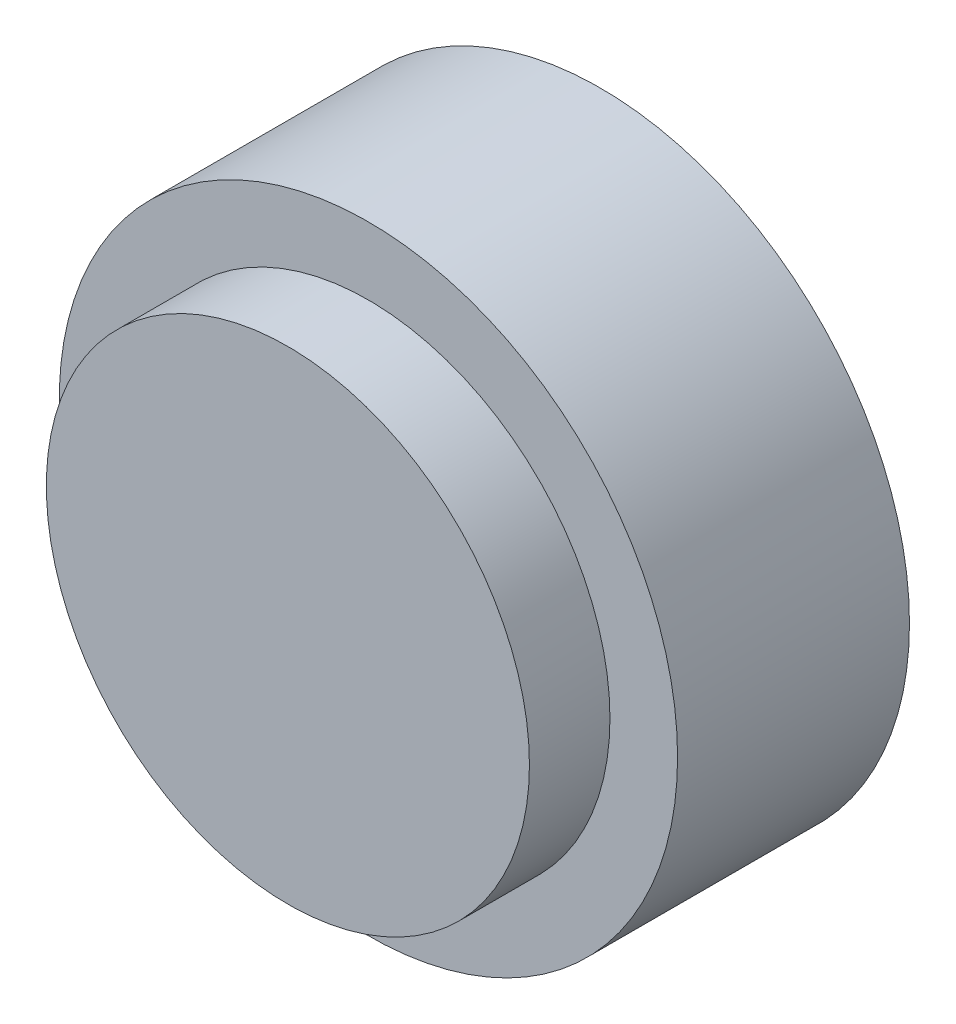
ISO-10303-21;
HEADER;
FILE_DESCRIPTION(('STEP AP214'),'2;1');
FILE_NAME('part.step','',(''),(''),'','','');
FILE_SCHEMA(('AUTOMOTIVE_DESIGN { 1 0 10303 214 1 1 1 1 }'));
ENDSEC;
DATA;
#1=APPLICATION_CONTEXT('core data for automotive mechanical design processes');
#2=APPLICATION_PROTOCOL_DEFINITION('international standard','automotive_design',2000,#1);
#3=PRODUCT_CONTEXT('',#1,'mechanical');
#4=PRODUCT('Part','Part','',(#3));
#5=PRODUCT_RELATED_PRODUCT_CATEGORY('part','',(#4));
#6=PRODUCT_DEFINITION_FORMATION('','',#4);
#7=PRODUCT_DEFINITION_CONTEXT('part definition',#1,'design');
#8=PRODUCT_DEFINITION('design','',#6,#7);
#9=PRODUCT_DEFINITION_SHAPE('','',#8);
#10=(LENGTH_UNIT() NAMED_UNIT(*) SI_UNIT(.MILLI.,.METRE.));
#11=(NAMED_UNIT(*) PLANE_ANGLE_UNIT() SI_UNIT($,.RADIAN.));
#12=(NAMED_UNIT(*) SI_UNIT($,.STERADIAN.) SOLID_ANGLE_UNIT());
#13=UNCERTAINTY_MEASURE_WITH_UNIT(LENGTH_MEASURE(1.E-05),#10,'distance_accuracy_value','');
#14=(GEOMETRIC_REPRESENTATION_CONTEXT(3) GLOBAL_UNCERTAINTY_ASSIGNED_CONTEXT((#13)) GLOBAL_UNIT_ASSIGNED_CONTEXT((#10,
#11,#12)) REPRESENTATION_CONTEXT('',''));
#15=CARTESIAN_POINT('',(0.,0.,0.));
#16=DIRECTION('',(0.,0.,1.));
#17=DIRECTION('',(1.,0.,0.));
#18=AXIS2_PLACEMENT_3D('',#15,#16,#17);
#19=CARTESIAN_POINT('',(0.,0.,12.5));
#20=DIRECTION('',(0.,0.,-1.));
#21=DIRECTION('',(-1.,0.,0.));
#22=AXIS2_PLACEMENT_3D('',#19,#20,#21);
#23=CYLINDRICAL_SURFACE('',#22,37.5);
#24=CARTESIAN_POINT('',(0.,0.,12.5));
#25=DIRECTION('',(0.,0.,1.));
#26=DIRECTION('',(1.,0.,0.));
#27=AXIS2_PLACEMENT_3D('',#24,#25,#26);
#28=CIRCLE('',#27,37.5);
#29=CARTESIAN_POINT('',(37.5,0.,12.5));
#30=VERTEX_POINT('',#29);
#31=EDGE_CURVE('E49',#30,#30,#28,.T.);
#32=ORIENTED_EDGE('',*,*,#31,.F.);
#33=EDGE_LOOP('',(#32));
#34=FACE_BOUND('',#33,.T.);
#35=CARTESIAN_POINT('',(0.,0.,0.));
#36=DIRECTION('',(0.,0.,1.));
#37=DIRECTION('',(1.,0.,0.));
#38=AXIS2_PLACEMENT_3D('',#35,#36,#37);
#39=CIRCLE('',#38,37.5);
#40=CARTESIAN_POINT('',(37.5,0.,0.));
#41=VERTEX_POINT('',#40);
#42=EDGE_CURVE('E161',#41,#41,#39,.T.);
#43=ORIENTED_EDGE('',*,*,#42,.T.);
#44=EDGE_LOOP('',(#43));
#45=FACE_BOUND('',#44,.T.);
#46=ADVANCED_FACE('F42',(#34,#45),#23,.T.);
#47=CARTESIAN_POINT('',(0.,0.,12.5));
#48=DIRECTION('',(0.,0.,1.));
#49=DIRECTION('',(1.,0.,0.));
#50=AXIS2_PLACEMENT_3D('',#47,#48,#49);
#51=PLANE('',#50);
#52=ORIENTED_EDGE('',*,*,#31,.T.);
#53=EDGE_LOOP('',(#52));
#54=FACE_BOUND('',#53,.T.);
#55=ADVANCED_FACE('F168',(#54),#51,.T.);
#56=CARTESIAN_POINT('',(0.,0.,-36.));
#57=DIRECTION('',(0.,0.,1.));
#58=DIRECTION('',(1.,0.,0.));
#59=AXIS2_PLACEMENT_3D('',#56,#57,#58);
#60=CYLINDRICAL_SURFACE('',#59,48.);
#61=CARTESIAN_POINT('',(0.,0.,-36.));
#62=DIRECTION('',(0.,0.,1.));
#63=DIRECTION('',(1.,0.,0.));
#64=AXIS2_PLACEMENT_3D('',#61,#62,#63);
#65=CIRCLE('',#64,48.);
#66=CARTESIAN_POINT('',(48.,0.,-36.));
#67=VERTEX_POINT('',#66);
#68=EDGE_CURVE('E155',#67,#67,#65,.T.);
#69=ORIENTED_EDGE('',*,*,#68,.T.);
#70=EDGE_LOOP('',(#69));
#71=FACE_BOUND('',#70,.T.);
#72=CARTESIAN_POINT('',(0.,0.,0.));
#73=DIRECTION('',(0.,0.,1.));
#74=DIRECTION('',(1.,0.,0.));
#75=AXIS2_PLACEMENT_3D('',#72,#73,#74);
#76=CIRCLE('',#75,48.);
#77=CARTESIAN_POINT('',(48.,0.,0.));
#78=VERTEX_POINT('',#77);
#79=EDGE_CURVE('E154',#78,#78,#76,.T.);
#80=ORIENTED_EDGE('',*,*,#79,.F.);
#81=EDGE_LOOP('',(#80));
#82=FACE_BOUND('',#81,.T.);
#83=ADVANCED_FACE('F182',(#71,#82),#60,.T.);
#84=CARTESIAN_POINT('',(0.,0.,-36.));
#85=DIRECTION('',(0.,0.,1.));
#86=DIRECTION('',(1.,0.,0.));
#87=AXIS2_PLACEMENT_3D('',#84,#85,#86);
#88=CYLINDRICAL_SURFACE('',#87,21.);
#89=CARTESIAN_POINT('',(0.,0.,-36.));
#90=DIRECTION('',(0.,0.,1.));
#91=DIRECTION('',(1.,0.,0.));
#92=AXIS2_PLACEMENT_3D('',#89,#90,#91);
#93=CIRCLE('',#92,21.);
#94=CARTESIAN_POINT('',(21.,0.,-36.));
#95=VERTEX_POINT('',#94);
#96=EDGE_CURVE('E158',#95,#95,#93,.T.);
#97=ORIENTED_EDGE('',*,*,#96,.F.);
#98=EDGE_LOOP('',(#97));
#99=FACE_BOUND('',#98,.T.);
#100=CARTESIAN_POINT('',(0.,0.,0.));
#101=DIRECTION('',(0.,0.,1.));
#102=DIRECTION('',(1.,0.,0.));
#103=AXIS2_PLACEMENT_3D('',#100,#101,#102);
#104=CIRCLE('',#103,21.);
#105=CARTESIAN_POINT('',(21.,0.,0.));
#106=VERTEX_POINT('',#105);
#107=EDGE_CURVE('E11',#106,#106,#104,.T.);
#108=ORIENTED_EDGE('',*,*,#107,.T.);
#109=EDGE_LOOP('',(#108));
#110=FACE_BOUND('',#109,.T.);
#111=ADVANCED_FACE('F184',(#99,#110),#88,.F.);
#112=CARTESIAN_POINT('',(0.,0.,-36.));
#113=DIRECTION('',(0.,0.,1.));
#114=DIRECTION('',(1.,0.,0.));
#115=AXIS2_PLACEMENT_3D('',#112,#113,#114);
#116=PLANE('',#115);
#117=CARTESIAN_POINT('',(0.,42.,-36.));
#118=DIRECTION('',(0.,0.,-1.));
#119=DIRECTION('',(-1.,0.,0.));
#120=AXIS2_PLACEMENT_3D('',#117,#118,#119);
#121=CIRCLE('',#120,2.025);
#122=CARTESIAN_POINT('',(-2.025,42.,-36.));
#123=VERTEX_POINT('',#122);
#124=EDGE_CURVE('E91',#123,#123,#121,.T.);
#125=ORIENTED_EDGE('',*,*,#124,.F.);
#126=EDGE_LOOP('',(#125));
#127=FACE_BOUND('',#126,.T.);
#128=CARTESIAN_POINT('',(-29.6984848098355,29.6984848098363,-36.));
#129=DIRECTION('',(0.,0.,-1.));
#130=DIRECTION('',(-1.,0.,0.));
#131=AXIS2_PLACEMENT_3D('',#128,#129,#130);
#132=CIRCLE('',#131,2.025);
#133=CARTESIAN_POINT('',(-31.7234848098355,29.6984848098363,-36.));
#134=VERTEX_POINT('',#133);
#135=EDGE_CURVE('E84',#134,#134,#132,.T.);
#136=ORIENTED_EDGE('',*,*,#135,.F.);
#137=EDGE_LOOP('',(#136));
#138=FACE_BOUND('',#137,.T.);
#139=CARTESIAN_POINT('',(-42.0000000000018,1.78285241928082E-12,-36.));
#140=DIRECTION('',(0.,0.,-1.));
#141=DIRECTION('',(-1.,0.,0.));
#142=AXIS2_PLACEMENT_3D('',#139,#140,#141);
#143=CIRCLE('',#142,2.025);
#144=CARTESIAN_POINT('',(-44.0250000000018,1.78285241928082E-12,-36.));
#145=VERTEX_POINT('',#144);
#146=EDGE_CURVE('E100',#145,#145,#143,.T.);
#147=ORIENTED_EDGE('',*,*,#146,.F.);
#148=EDGE_LOOP('',(#147));
#149=FACE_BOUND('',#148,.T.);
#150=CARTESIAN_POINT('',(-29.698484809838,-29.6984848098337,-36.));
#151=DIRECTION('',(0.,0.,-1.));
#152=DIRECTION('',(-1.,0.,0.));
#153=AXIS2_PLACEMENT_3D('',#150,#151,#152);
#154=CIRCLE('',#153,2.025);
#155=CARTESIAN_POINT('',(-31.723484809838,-29.6984848098337,-36.));
#156=VERTEX_POINT('',#155);
#157=EDGE_CURVE('E109',#156,#156,#154,.T.);
#158=ORIENTED_EDGE('',*,*,#157,.F.);
#159=EDGE_LOOP('',(#158));
#160=FACE_BOUND('',#159,.T.);
#161=CARTESIAN_POINT('',(-3.56570483856165E-12,-42.,-36.));
#162=DIRECTION('',(0.,0.,-1.));
#163=DIRECTION('',(-1.,0.,0.));
#164=AXIS2_PLACEMENT_3D('',#161,#162,#163);
#165=CIRCLE('',#164,2.025);
#166=CARTESIAN_POINT('',(-2.02500000000357,-42.,-36.));
#167=VERTEX_POINT('',#166);
#168=EDGE_CURVE('E118',#167,#167,#165,.T.);
#169=ORIENTED_EDGE('',*,*,#168,.F.);
#170=EDGE_LOOP('',(#169));
#171=FACE_BOUND('',#170,.T.);
#172=CARTESIAN_POINT('',(29.698484809832,-29.6984848098363,-36.));
#173=DIRECTION('',(0.,0.,-1.));
#174=DIRECTION('',(-1.,0.,0.));
#175=AXIS2_PLACEMENT_3D('',#172,#173,#174);
#176=CIRCLE('',#175,2.025);
#177=CARTESIAN_POINT('',(27.673484809832,-29.6984848098363,-36.));
#178=VERTEX_POINT('',#177);
#179=EDGE_CURVE('E127',#178,#178,#176,.T.);
#180=ORIENTED_EDGE('',*,*,#179,.F.);
#181=EDGE_LOOP('',(#180));
#182=FACE_BOUND('',#181,.T.);
#183=CARTESIAN_POINT('',(41.9999999999982,-1.78799593583724E-12,-36.));
#184=DIRECTION('',(0.,0.,-1.));
#185=DIRECTION('',(-1.,0.,0.));
#186=AXIS2_PLACEMENT_3D('',#183,#184,#185);
#187=CIRCLE('',#186,2.025);
#188=CARTESIAN_POINT('',(39.9749999999982,-1.78799593583724E-12,-36.));
#189=VERTEX_POINT('',#188);
#190=EDGE_CURVE('E136',#189,#189,#187,.T.);
#191=ORIENTED_EDGE('',*,*,#190,.F.);
#192=EDGE_LOOP('',(#191));
#193=FACE_BOUND('',#192,.T.);
#194=CARTESIAN_POINT('',(29.6984848098345,29.6984848098337,-36.));
#195=DIRECTION('',(0.,0.,-1.));
#196=DIRECTION('',(-1.,0.,0.));
#197=AXIS2_PLACEMENT_3D('',#194,#195,#196);
#198=CIRCLE('',#197,2.025);
#199=CARTESIAN_POINT('',(27.6734848098345,29.6984848098337,-36.));
#200=VERTEX_POINT('',#199);
#201=EDGE_CURVE('E145',#200,#200,#198,.T.);
#202=ORIENTED_EDGE('',*,*,#201,.F.);
#203=EDGE_LOOP('',(#202));
#204=FACE_BOUND('',#203,.T.);
#205=ORIENTED_EDGE('',*,*,#68,.F.);
#206=EDGE_LOOP('',(#205));
#207=FACE_BOUND('',#206,.T.);
#208=ORIENTED_EDGE('',*,*,#96,.T.);
#209=EDGE_LOOP('',(#208));
#210=FACE_BOUND('',#209,.T.);
#211=ADVANCED_FACE('F178',(#127,#138,#149,#160,#171,#182,#193,#204,#207,#210),#116,.F.);
#212=CARTESIAN_POINT('',(0.,0.,0.));
#213=DIRECTION('',(0.,0.,1.));
#214=DIRECTION('',(1.,0.,0.));
#215=AXIS2_PLACEMENT_3D('',#212,#213,#214);
#216=PLANE('',#215);
#217=ORIENTED_EDGE('',*,*,#42,.F.);
#218=EDGE_LOOP('',(#217));
#219=FACE_BOUND('',#218,.T.);
#220=ORIENTED_EDGE('',*,*,#79,.T.);
#221=EDGE_LOOP('',(#220));
#222=FACE_BOUND('',#221,.T.);
#223=ADVANCED_FACE('F174',(#219,#222),#216,.T.);
#224=CARTESIAN_POINT('',(0.,0.,0.));
#225=DIRECTION('',(0.,0.,1.));
#226=DIRECTION('',(1.,0.,0.));
#227=AXIS2_PLACEMENT_3D('',#224,#225,#226);
#228=PLANE('',#227);
#229=ORIENTED_EDGE('',*,*,#107,.F.);
#230=EDGE_LOOP('',(#229));
#231=FACE_BOUND('',#230,.T.);
#232=ADVANCED_FACE('F177',(#231),#228,.F.);
#233=CARTESIAN_POINT('',(29.6984848098345,29.6984848098337,-30.4));
#234=DIRECTION('',(0.,0.,-1.));
#235=DIRECTION('',(-1.,0.,0.));
#236=AXIS2_PLACEMENT_3D('',#233,#234,#235);
#237=CONICAL_SURFACE('',#236,1.65,1.02974425867665);
#238=CARTESIAN_POINT('',(29.6984848098345,29.6984848098337,-29.4085799786045));
#239=VERTEX_POINT('',#238);
#240=VERTEX_LOOP('',#239);
#241=FACE_BOUND('',#240,.T.);
#242=CARTESIAN_POINT('',(29.6984848098345,29.6984848098337,-30.4));
#243=DIRECTION('',(0.,0.,-1.));
#244=DIRECTION('',(-1.,0.,0.));
#245=AXIS2_PLACEMENT_3D('',#242,#243,#244);
#246=CIRCLE('',#245,1.65);
#247=CARTESIAN_POINT('',(28.0484848098345,29.6984848098337,-30.4));
#248=VERTEX_POINT('',#247);
#249=EDGE_CURVE('E151',#248,#248,#246,.T.);
#250=ORIENTED_EDGE('',*,*,#249,.T.);
#251=EDGE_LOOP('',(#250));
#252=FACE_BOUND('',#251,.T.);
#253=ADVANCED_FACE('F195',(#241,#252),#237,.F.);
#254=CARTESIAN_POINT('',(29.6984848098345,29.6984848098337,-36.));
#255=DIRECTION('',(0.,0.,-1.));
#256=DIRECTION('',(-1.,0.,0.));
#257=AXIS2_PLACEMENT_3D('',#254,#255,#256);
#258=CYLINDRICAL_SURFACE('',#257,1.65);
#259=ORIENTED_EDGE('',*,*,#249,.F.);
#260=EDGE_LOOP('',(#259));
#261=FACE_BOUND('',#260,.T.);
#262=CARTESIAN_POINT('',(29.6984848098345,29.6984848098337,-35.625));
#263=DIRECTION('',(0.,0.,-1.));
#264=DIRECTION('',(-1.,0.,0.));
#265=AXIS2_PLACEMENT_3D('',#262,#263,#264);
#266=CIRCLE('',#265,1.65);
#267=CARTESIAN_POINT('',(28.0484848098345,29.6984848098337,-35.625));
#268=VERTEX_POINT('',#267);
#269=EDGE_CURVE('E148',#268,#268,#266,.T.);
#270=ORIENTED_EDGE('',*,*,#269,.T.);
#271=EDGE_LOOP('',(#270));
#272=FACE_BOUND('',#271,.T.);
#273=ADVANCED_FACE('F200',(#261,#272),#258,.F.);
#274=CARTESIAN_POINT('',(29.6984848098345,29.6984848098337,-36.));
#275=DIRECTION('',(0.,0.,-1.));
#276=DIRECTION('',(-1.,0.,0.));
#277=AXIS2_PLACEMENT_3D('',#274,#275,#276);
#278=CONICAL_SURFACE('',#277,2.025,0.785398163397458);
#279=ORIENTED_EDGE('',*,*,#269,.F.);
#280=EDGE_LOOP('',(#279));
#281=FACE_BOUND('',#280,.T.);
#282=ORIENTED_EDGE('',*,*,#201,.T.);
#283=EDGE_LOOP('',(#282));
#284=FACE_BOUND('',#283,.T.);
#285=ADVANCED_FACE('F207',(#281,#284),#278,.F.);
#286=CARTESIAN_POINT('',(41.9999999999982,-1.78799593583724E-12,-30.4));
#287=DIRECTION('',(0.,0.,-1.));
#288=DIRECTION('',(-1.,0.,0.));
#289=AXIS2_PLACEMENT_3D('',#286,#287,#288);
#290=CONICAL_SURFACE('',#289,1.65,1.02974425867666);
#291=CARTESIAN_POINT('',(41.9999999999982,-1.78799593583724E-12,-29.4085799786045));
#292=VERTEX_POINT('',#291);
#293=VERTEX_LOOP('',#292);
#294=FACE_BOUND('',#293,.T.);
#295=CARTESIAN_POINT('',(41.9999999999982,-1.78799593583724E-12,-30.4));
#296=DIRECTION('',(0.,0.,-1.));
#297=DIRECTION('',(-1.,0.,0.));
#298=AXIS2_PLACEMENT_3D('',#295,#296,#297);
#299=CIRCLE('',#298,1.65);
#300=CARTESIAN_POINT('',(40.3499999999982,-1.78799593583724E-12,-30.4));
#301=VERTEX_POINT('',#300);
#302=EDGE_CURVE('E142',#301,#301,#299,.T.);
#303=ORIENTED_EDGE('',*,*,#302,.T.);
#304=EDGE_LOOP('',(#303));
#305=FACE_BOUND('',#304,.T.);
#306=ADVANCED_FACE('F239',(#294,#305),#290,.F.);
#307=CARTESIAN_POINT('',(41.9999999999982,-1.78799593583724E-12,-36.));
#308=DIRECTION('',(0.,0.,-1.));
#309=DIRECTION('',(-1.,0.,0.));
#310=AXIS2_PLACEMENT_3D('',#307,#308,#309);
#311=CYLINDRICAL_SURFACE('',#310,1.65);
#312=ORIENTED_EDGE('',*,*,#302,.F.);
#313=EDGE_LOOP('',(#312));
#314=FACE_BOUND('',#313,.T.);
#315=CARTESIAN_POINT('',(41.9999999999982,-1.78799593583724E-12,-35.625));
#316=DIRECTION('',(0.,0.,-1.));
#317=DIRECTION('',(-1.,0.,0.));
#318=AXIS2_PLACEMENT_3D('',#315,#316,#317);
#319=CIRCLE('',#318,1.65);
#320=CARTESIAN_POINT('',(40.3499999999982,-1.78799593583724E-12,-35.625));
#321=VERTEX_POINT('',#320);
#322=EDGE_CURVE('E139',#321,#321,#319,.T.);
#323=ORIENTED_EDGE('',*,*,#322,.T.);
#324=EDGE_LOOP('',(#323));
#325=FACE_BOUND('',#324,.T.);
#326=ADVANCED_FACE('F244',(#314,#325),#311,.F.);
#327=CARTESIAN_POINT('',(41.9999999999982,-1.78799593583724E-12,-36.));
#328=DIRECTION('',(0.,0.,-1.));
#329=DIRECTION('',(-1.,0.,0.));
#330=AXIS2_PLACEMENT_3D('',#327,#328,#329);
#331=CONICAL_SURFACE('',#330,2.025,0.785398163397448);
#332=ORIENTED_EDGE('',*,*,#322,.F.);
#333=EDGE_LOOP('',(#332));
#334=FACE_BOUND('',#333,.T.);
#335=ORIENTED_EDGE('',*,*,#190,.T.);
#336=EDGE_LOOP('',(#335));
#337=FACE_BOUND('',#336,.T.);
#338=ADVANCED_FACE('F250',(#334,#337),#331,.F.);
#339=CARTESIAN_POINT('',(29.698484809832,-29.6984848098363,-30.4));
#340=DIRECTION('',(0.,0.,-1.));
#341=DIRECTION('',(-1.,0.,0.));
#342=AXIS2_PLACEMENT_3D('',#339,#340,#341);
#343=CONICAL_SURFACE('',#342,1.65,1.02974425867666);
#344=CARTESIAN_POINT('',(29.698484809832,-29.6984848098363,-29.4085799786045));
#345=VERTEX_POINT('',#344);
#346=VERTEX_LOOP('',#345);
#347=FACE_BOUND('',#346,.T.);
#348=CARTESIAN_POINT('',(29.698484809832,-29.6984848098363,-30.4));
#349=DIRECTION('',(0.,0.,-1.));
#350=DIRECTION('',(-1.,0.,0.));
#351=AXIS2_PLACEMENT_3D('',#348,#349,#350);
#352=CIRCLE('',#351,1.65);
#353=CARTESIAN_POINT('',(28.048484809832,-29.6984848098363,-30.4));
#354=VERTEX_POINT('',#353);
#355=EDGE_CURVE('E133',#354,#354,#352,.T.);
#356=ORIENTED_EDGE('',*,*,#355,.T.);
#357=EDGE_LOOP('',(#356));
#358=FACE_BOUND('',#357,.T.);
#359=ADVANCED_FACE('F254',(#347,#358),#343,.F.);
#360=CARTESIAN_POINT('',(29.698484809832,-29.6984848098363,-36.));
#361=DIRECTION('',(0.,0.,-1.));
#362=DIRECTION('',(-1.,0.,0.));
#363=AXIS2_PLACEMENT_3D('',#360,#361,#362);
#364=CYLINDRICAL_SURFACE('',#363,1.65);
#365=ORIENTED_EDGE('',*,*,#355,.F.);
#366=EDGE_LOOP('',(#365));
#367=FACE_BOUND('',#366,.T.);
#368=CARTESIAN_POINT('',(29.698484809832,-29.6984848098363,-35.625));
#369=DIRECTION('',(0.,0.,-1.));
#370=DIRECTION('',(-1.,0.,0.));
#371=AXIS2_PLACEMENT_3D('',#368,#369,#370);
#372=CIRCLE('',#371,1.65);
#373=CARTESIAN_POINT('',(28.048484809832,-29.6984848098363,-35.625));
#374=VERTEX_POINT('',#373);
#375=EDGE_CURVE('E130',#374,#374,#372,.T.);
#376=ORIENTED_EDGE('',*,*,#375,.T.);
#377=EDGE_LOOP('',(#376));
#378=FACE_BOUND('',#377,.T.);
#379=ADVANCED_FACE('F258',(#367,#378),#364,.F.);
#380=CARTESIAN_POINT('',(29.698484809832,-29.6984848098363,-36.));
#381=DIRECTION('',(0.,0.,-1.));
#382=DIRECTION('',(-1.,0.,0.));
#383=AXIS2_PLACEMENT_3D('',#380,#381,#382);
#384=CONICAL_SURFACE('',#383,2.025,0.785398163397448);
#385=ORIENTED_EDGE('',*,*,#375,.F.);
#386=EDGE_LOOP('',(#385));
#387=FACE_BOUND('',#386,.T.);
#388=ORIENTED_EDGE('',*,*,#179,.T.);
#389=EDGE_LOOP('',(#388));
#390=FACE_BOUND('',#389,.T.);
#391=ADVANCED_FACE('F262',(#387,#390),#384,.F.);
#392=CARTESIAN_POINT('',(-3.56570483856165E-12,-42.,-30.4));
#393=DIRECTION('',(0.,0.,-1.));
#394=DIRECTION('',(-1.,0.,0.));
#395=AXIS2_PLACEMENT_3D('',#392,#393,#394);
#396=CONICAL_SURFACE('',#395,1.65,1.02974425867665);
#397=CARTESIAN_POINT('',(-3.56731927084786E-12,-42.,-29.4085799786045));
#398=VERTEX_POINT('',#397);
#399=VERTEX_LOOP('',#398);
#400=FACE_BOUND('',#399,.T.);
#401=CARTESIAN_POINT('',(-3.56570483856165E-12,-42.,-30.4));
#402=DIRECTION('',(0.,0.,-1.));
#403=DIRECTION('',(-1.,0.,0.));
#404=AXIS2_PLACEMENT_3D('',#401,#402,#403);
#405=CIRCLE('',#404,1.65);
#406=CARTESIAN_POINT('',(-1.65000000000356,-42.,-30.4));
#407=VERTEX_POINT('',#406);
#408=EDGE_CURVE('E124',#407,#407,#405,.T.);
#409=ORIENTED_EDGE('',*,*,#408,.T.);
#410=EDGE_LOOP('',(#409));
#411=FACE_BOUND('',#410,.T.);
#412=ADVANCED_FACE('F266',(#400,#411),#396,.F.);
#413=CARTESIAN_POINT('',(-3.56570483856165E-12,-42.,-36.));
#414=DIRECTION('',(0.,0.,-1.));
#415=DIRECTION('',(-1.,0.,0.));
#416=AXIS2_PLACEMENT_3D('',#413,#414,#415);
#417=CYLINDRICAL_SURFACE('',#416,1.65);
#418=ORIENTED_EDGE('',*,*,#408,.F.);
#419=EDGE_LOOP('',(#418));
#420=FACE_BOUND('',#419,.T.);
#421=CARTESIAN_POINT('',(-3.56570483856165E-12,-42.,-35.625));
#422=DIRECTION('',(0.,0.,-1.));
#423=DIRECTION('',(-1.,0.,0.));
#424=AXIS2_PLACEMENT_3D('',#421,#422,#423);
#425=CIRCLE('',#424,1.65);
#426=CARTESIAN_POINT('',(-1.65000000000356,-42.,-35.625));
#427=VERTEX_POINT('',#426);
#428=EDGE_CURVE('E121',#427,#427,#425,.T.);
#429=ORIENTED_EDGE('',*,*,#428,.T.);
#430=EDGE_LOOP('',(#429));
#431=FACE_BOUND('',#430,.T.);
#432=ADVANCED_FACE('F270',(#420,#431),#417,.F.);
#433=CARTESIAN_POINT('',(-3.56570483856165E-12,-42.,-36.));
#434=DIRECTION('',(0.,0.,-1.));
#435=DIRECTION('',(-1.,0.,0.));
#436=AXIS2_PLACEMENT_3D('',#433,#434,#435);
#437=CONICAL_SURFACE('',#436,2.025,0.78539816339745);
#438=ORIENTED_EDGE('',*,*,#428,.F.);
#439=EDGE_LOOP('',(#438));
#440=FACE_BOUND('',#439,.T.);
#441=ORIENTED_EDGE('',*,*,#168,.T.);
#442=EDGE_LOOP('',(#441));
#443=FACE_BOUND('',#442,.T.);
#444=ADVANCED_FACE('F274',(#440,#443),#437,.F.);
#445=CARTESIAN_POINT('',(-29.698484809838,-29.6984848098337,-30.4));
#446=DIRECTION('',(0.,0.,-1.));
#447=DIRECTION('',(-1.,0.,0.));
#448=AXIS2_PLACEMENT_3D('',#445,#446,#447);
#449=CONICAL_SURFACE('',#448,1.65,1.02974425867666);
#450=CARTESIAN_POINT('',(-29.698484809838,-29.6984848098337,-29.4085799786045));
#451=VERTEX_POINT('',#450);
#452=VERTEX_LOOP('',#451);
#453=FACE_BOUND('',#452,.T.);
#454=CARTESIAN_POINT('',(-29.698484809838,-29.6984848098337,-30.4));
#455=DIRECTION('',(0.,0.,-1.));
#456=DIRECTION('',(-1.,0.,0.));
#457=AXIS2_PLACEMENT_3D('',#454,#455,#456);
#458=CIRCLE('',#457,1.65);
#459=CARTESIAN_POINT('',(-31.348484809838,-29.6984848098337,-30.4));
#460=VERTEX_POINT('',#459);
#461=EDGE_CURVE('E115',#460,#460,#458,.T.);
#462=ORIENTED_EDGE('',*,*,#461,.T.);
#463=EDGE_LOOP('',(#462));
#464=FACE_BOUND('',#463,.T.);
#465=ADVANCED_FACE('F278',(#453,#464),#449,.F.);
#466=CARTESIAN_POINT('',(-29.698484809838,-29.6984848098337,-36.));
#467=DIRECTION('',(0.,0.,-1.));
#468=DIRECTION('',(-1.,0.,0.));
#469=AXIS2_PLACEMENT_3D('',#466,#467,#468);
#470=CYLINDRICAL_SURFACE('',#469,1.65);
#471=ORIENTED_EDGE('',*,*,#461,.F.);
#472=EDGE_LOOP('',(#471));
#473=FACE_BOUND('',#472,.T.);
#474=CARTESIAN_POINT('',(-29.698484809838,-29.6984848098337,-35.625));
#475=DIRECTION('',(0.,0.,-1.));
#476=DIRECTION('',(-1.,0.,0.));
#477=AXIS2_PLACEMENT_3D('',#474,#475,#476);
#478=CIRCLE('',#477,1.65);
#479=CARTESIAN_POINT('',(-31.348484809838,-29.6984848098337,-35.625));
#480=VERTEX_POINT('',#479);
#481=EDGE_CURVE('E112',#480,#480,#478,.T.);
#482=ORIENTED_EDGE('',*,*,#481,.T.);
#483=EDGE_LOOP('',(#482));
#484=FACE_BOUND('',#483,.T.);
#485=ADVANCED_FACE('F282',(#473,#484),#470,.F.);
#486=CARTESIAN_POINT('',(-29.698484809838,-29.6984848098337,-36.));
#487=DIRECTION('',(0.,0.,-1.));
#488=DIRECTION('',(-1.,0.,0.));
#489=AXIS2_PLACEMENT_3D('',#486,#487,#488);
#490=CONICAL_SURFACE('',#489,2.025,0.785398163397448);
#491=ORIENTED_EDGE('',*,*,#481,.F.);
#492=EDGE_LOOP('',(#491));
#493=FACE_BOUND('',#492,.T.);
#494=ORIENTED_EDGE('',*,*,#157,.T.);
#495=EDGE_LOOP('',(#494));
#496=FACE_BOUND('',#495,.T.);
#497=ADVANCED_FACE('F286',(#493,#496),#490,.F.);
#498=CARTESIAN_POINT('',(-42.0000000000018,1.78285241928082E-12,-30.4));
#499=DIRECTION('',(0.,0.,-1.));
#500=DIRECTION('',(-1.,0.,0.));
#501=AXIS2_PLACEMENT_3D('',#498,#499,#500);
#502=CONICAL_SURFACE('',#501,1.65,1.02974425867666);
#503=CARTESIAN_POINT('',(-42.0000000000018,1.78285241928082E-12,-29.4085799786045));
#504=VERTEX_POINT('',#503);
#505=VERTEX_LOOP('',#504);
#506=FACE_BOUND('',#505,.T.);
#507=CARTESIAN_POINT('',(-42.0000000000018,1.78285241928082E-12,-30.4));
#508=DIRECTION('',(0.,0.,-1.));
#509=DIRECTION('',(-1.,0.,0.));
#510=AXIS2_PLACEMENT_3D('',#507,#508,#509);
#511=CIRCLE('',#510,1.65);
#512=CARTESIAN_POINT('',(-43.6500000000018,1.78285241928082E-12,-30.4));
#513=VERTEX_POINT('',#512);
#514=EDGE_CURVE('E106',#513,#513,#511,.T.);
#515=ORIENTED_EDGE('',*,*,#514,.T.);
#516=EDGE_LOOP('',(#515));
#517=FACE_BOUND('',#516,.T.);
#518=ADVANCED_FACE('F290',(#506,#517),#502,.F.);
#519=CARTESIAN_POINT('',(-42.0000000000018,1.78285241928082E-12,-36.));
#520=DIRECTION('',(0.,0.,-1.));
#521=DIRECTION('',(-1.,0.,0.));
#522=AXIS2_PLACEMENT_3D('',#519,#520,#521);
#523=CYLINDRICAL_SURFACE('',#522,1.65);
#524=ORIENTED_EDGE('',*,*,#514,.F.);
#525=EDGE_LOOP('',(#524));
#526=FACE_BOUND('',#525,.T.);
#527=CARTESIAN_POINT('',(-42.0000000000018,1.78285241928082E-12,-35.625));
#528=DIRECTION('',(0.,0.,-1.));
#529=DIRECTION('',(-1.,0.,0.));
#530=AXIS2_PLACEMENT_3D('',#527,#528,#529);
#531=CIRCLE('',#530,1.65);
#532=CARTESIAN_POINT('',(-43.6500000000018,1.78285241928082E-12,-35.625));
#533=VERTEX_POINT('',#532);
#534=EDGE_CURVE('E103',#533,#533,#531,.T.);
#535=ORIENTED_EDGE('',*,*,#534,.T.);
#536=EDGE_LOOP('',(#535));
#537=FACE_BOUND('',#536,.T.);
#538=ADVANCED_FACE('F294',(#526,#537),#523,.F.);
#539=CARTESIAN_POINT('',(-42.0000000000018,1.78285241928082E-12,-36.));
#540=DIRECTION('',(0.,0.,-1.));
#541=DIRECTION('',(-1.,0.,0.));
#542=AXIS2_PLACEMENT_3D('',#539,#540,#541);
#543=CONICAL_SURFACE('',#542,2.025,0.785398163397448);
#544=ORIENTED_EDGE('',*,*,#534,.F.);
#545=EDGE_LOOP('',(#544));
#546=FACE_BOUND('',#545,.T.);
#547=ORIENTED_EDGE('',*,*,#146,.T.);
#548=EDGE_LOOP('',(#547));
#549=FACE_BOUND('',#548,.T.);
#550=ADVANCED_FACE('F298',(#546,#549),#543,.F.);
#551=CARTESIAN_POINT('',(-29.6984848098355,29.6984848098363,-30.4));
#552=DIRECTION('',(0.,0.,-1.));
#553=DIRECTION('',(-1.,0.,0.));
#554=AXIS2_PLACEMENT_3D('',#551,#552,#553);
#555=CONICAL_SURFACE('',#554,1.65,1.02974425867666);
#556=CARTESIAN_POINT('',(-29.6984848098355,29.6984848098363,-29.4085799786045));
#557=VERTEX_POINT('',#556);
#558=VERTEX_LOOP('',#557);
#559=FACE_BOUND('',#558,.T.);
#560=CARTESIAN_POINT('',(-29.6984848098355,29.6984848098363,-30.4));
#561=DIRECTION('',(0.,0.,-1.));
#562=DIRECTION('',(-1.,0.,0.));
#563=AXIS2_PLACEMENT_3D('',#560,#561,#562);
#564=CIRCLE('',#563,1.65);
#565=CARTESIAN_POINT('',(-31.3484848098355,29.6984848098363,-30.4));
#566=VERTEX_POINT('',#565);
#567=EDGE_CURVE('E97',#566,#566,#564,.T.);
#568=ORIENTED_EDGE('',*,*,#567,.T.);
#569=EDGE_LOOP('',(#568));
#570=FACE_BOUND('',#569,.T.);
#571=ADVANCED_FACE('F302',(#559,#570),#555,.F.);
#572=CARTESIAN_POINT('',(-29.6984848098355,29.6984848098363,-36.));
#573=DIRECTION('',(0.,0.,-1.));
#574=DIRECTION('',(-1.,0.,0.));
#575=AXIS2_PLACEMENT_3D('',#572,#573,#574);
#576=CYLINDRICAL_SURFACE('',#575,1.65);
#577=ORIENTED_EDGE('',*,*,#567,.F.);
#578=EDGE_LOOP('',(#577));
#579=FACE_BOUND('',#578,.T.);
#580=CARTESIAN_POINT('',(-29.6984848098355,29.6984848098363,-35.625));
#581=DIRECTION('',(0.,0.,-1.));
#582=DIRECTION('',(-1.,0.,0.));
#583=AXIS2_PLACEMENT_3D('',#580,#581,#582);
#584=CIRCLE('',#583,1.65);
#585=CARTESIAN_POINT('',(-31.3484848098355,29.6984848098363,-35.625));
#586=VERTEX_POINT('',#585);
#587=EDGE_CURVE('E88',#586,#586,#584,.T.);
#588=ORIENTED_EDGE('',*,*,#587,.T.);
#589=EDGE_LOOP('',(#588));
#590=FACE_BOUND('',#589,.T.);
#591=ADVANCED_FACE('F306',(#579,#590),#576,.F.);
#592=CARTESIAN_POINT('',(-29.6984848098355,29.6984848098363,-36.));
#593=DIRECTION('',(0.,0.,-1.));
#594=DIRECTION('',(-1.,0.,0.));
#595=AXIS2_PLACEMENT_3D('',#592,#593,#594);
#596=CONICAL_SURFACE('',#595,2.025,0.785398163397448);
#597=ORIENTED_EDGE('',*,*,#587,.F.);
#598=EDGE_LOOP('',(#597));
#599=FACE_BOUND('',#598,.T.);
#600=ORIENTED_EDGE('',*,*,#135,.T.);
#601=EDGE_LOOP('',(#600));
#602=FACE_BOUND('',#601,.T.);
#603=ADVANCED_FACE('F78',(#599,#602),#596,.F.);
#604=CARTESIAN_POINT('',(0.,42.,-30.4));
#605=DIRECTION('',(0.,0.,-1.));
#606=DIRECTION('',(-1.,0.,0.));
#607=AXIS2_PLACEMENT_3D('',#604,#605,#606);
#608=CONICAL_SURFACE('',#607,1.65,1.02974425867665);
#609=CARTESIAN_POINT('',(0.,42.,-29.4085799786045));
#610=VERTEX_POINT('',#609);
#611=VERTEX_LOOP('',#610);
#612=FACE_BOUND('',#611,.T.);
#613=CARTESIAN_POINT('',(0.,42.,-30.4));
#614=DIRECTION('',(0.,0.,-1.));
#615=DIRECTION('',(-1.,0.,0.));
#616=AXIS2_PLACEMENT_3D('',#613,#614,#615);
#617=CIRCLE('',#616,1.65);
#618=CARTESIAN_POINT('',(-1.65,42.,-30.4));
#619=VERTEX_POINT('',#618);
#620=EDGE_CURVE('E82',#619,#619,#617,.T.);
#621=ORIENTED_EDGE('',*,*,#620,.T.);
#622=EDGE_LOOP('',(#621));
#623=FACE_BOUND('',#622,.T.);
#624=ADVANCED_FACE('F74',(#612,#623),#608,.F.);
#625=CARTESIAN_POINT('',(0.,42.,-36.));
#626=DIRECTION('',(0.,0.,-1.));
#627=DIRECTION('',(-1.,0.,0.));
#628=AXIS2_PLACEMENT_3D('',#625,#626,#627);
#629=CYLINDRICAL_SURFACE('',#628,1.65);
#630=ORIENTED_EDGE('',*,*,#620,.F.);
#631=EDGE_LOOP('',(#630));
#632=FACE_BOUND('',#631,.T.);
#633=CARTESIAN_POINT('',(0.,42.,-35.625));
#634=DIRECTION('',(0.,0.,-1.));
#635=DIRECTION('',(-1.,0.,0.));
#636=AXIS2_PLACEMENT_3D('',#633,#634,#635);
#637=CIRCLE('',#636,1.65);
#638=CARTESIAN_POINT('',(-1.65,42.,-35.625));
#639=VERTEX_POINT('',#638);
#640=EDGE_CURVE('E85',#639,#639,#637,.T.);
#641=ORIENTED_EDGE('',*,*,#640,.T.);
#642=EDGE_LOOP('',(#641));
#643=FACE_BOUND('',#642,.T.);
#644=ADVANCED_FACE('F77',(#632,#643),#629,.F.);
#645=CARTESIAN_POINT('',(0.,42.,-36.));
#646=DIRECTION('',(0.,0.,-1.));
#647=DIRECTION('',(-1.,0.,0.));
#648=AXIS2_PLACEMENT_3D('',#645,#646,#647);
#649=CONICAL_SURFACE('',#648,2.025,0.78539816339745);
#650=ORIENTED_EDGE('',*,*,#640,.F.);
#651=EDGE_LOOP('',(#650));
#652=FACE_BOUND('',#651,.T.);
#653=ORIENTED_EDGE('',*,*,#124,.T.);
#654=EDGE_LOOP('',(#653));
#655=FACE_BOUND('',#654,.T.);
#656=ADVANCED_FACE('F316',(#652,#655),#649,.F.);
#657=CLOSED_SHELL('',(#46,#55,#83,#111,#211,#223,#232,#253,#273,#285,#306,#326,#338,#359,#379,
#391,#412,#432,#444,#465,#485,#497,#518,#538,#550,#571,#591,#603,#624,#644,#656));
#658=MANIFOLD_SOLID_BREP('B2',#657);
#659=ADVANCED_BREP_SHAPE_REPRESENTATION('',(#18,#658),#14);
#660=SHAPE_DEFINITION_REPRESENTATION(#9,#659);
ENDSEC;
END-ISO-10303-21;
